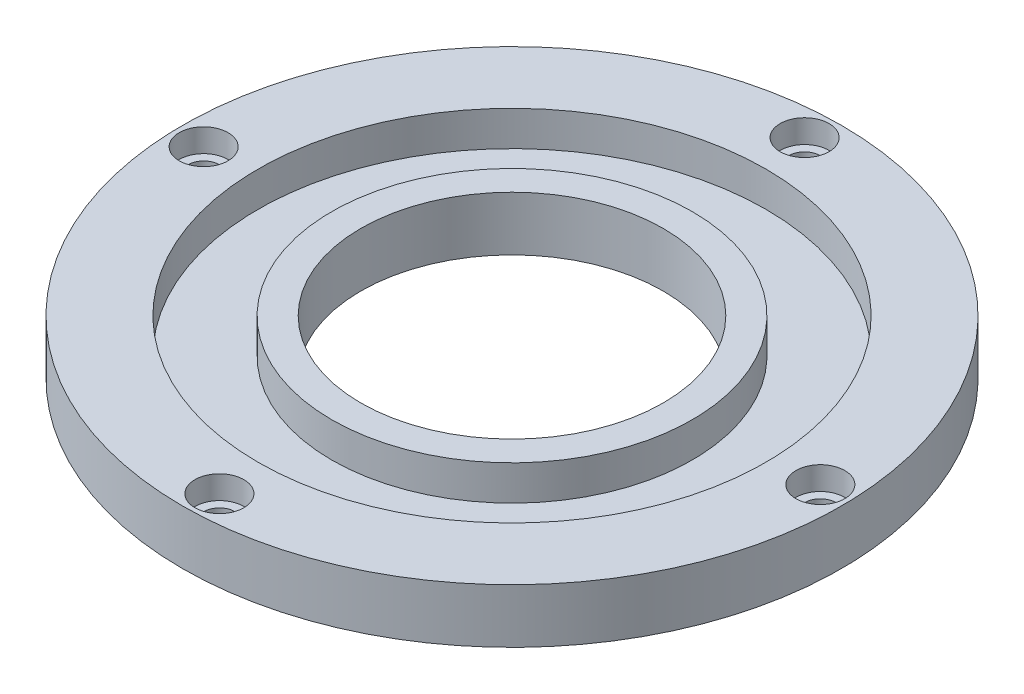
ISO-10303-21;
HEADER;
FILE_DESCRIPTION(('STEP AP214'),'2;1');
FILE_NAME('part.step','',(''),(''),'','','');
FILE_SCHEMA(('AUTOMOTIVE_DESIGN { 1 0 10303 214 1 1 1 1 }'));
ENDSEC;
DATA;
#1=APPLICATION_CONTEXT('core data for automotive mechanical design processes');
#2=APPLICATION_PROTOCOL_DEFINITION('international standard','automotive_design',2000,#1);
#3=PRODUCT_CONTEXT('',#1,'mechanical');
#4=PRODUCT('Part','Part','',(#3));
#5=PRODUCT_RELATED_PRODUCT_CATEGORY('part','',(#4));
#6=PRODUCT_DEFINITION_FORMATION('','',#4);
#7=PRODUCT_DEFINITION_CONTEXT('part definition',#1,'design');
#8=PRODUCT_DEFINITION('design','',#6,#7);
#9=PRODUCT_DEFINITION_SHAPE('','',#8);
#10=(LENGTH_UNIT() NAMED_UNIT(*) SI_UNIT(.MILLI.,.METRE.));
#11=(NAMED_UNIT(*) PLANE_ANGLE_UNIT() SI_UNIT($,.RADIAN.));
#12=(NAMED_UNIT(*) SI_UNIT($,.STERADIAN.) SOLID_ANGLE_UNIT());
#13=UNCERTAINTY_MEASURE_WITH_UNIT(LENGTH_MEASURE(1.E-05),#10,'distance_accuracy_value','');
#14=(GEOMETRIC_REPRESENTATION_CONTEXT(3) GLOBAL_UNCERTAINTY_ASSIGNED_CONTEXT((#13)) GLOBAL_UNIT_ASSIGNED_CONTEXT((#10,
#11,#12)) REPRESENTATION_CONTEXT('',''));
#15=CARTESIAN_POINT('',(0.,0.,0.));
#16=DIRECTION('',(0.,0.,1.));
#17=DIRECTION('',(1.,0.,0.));
#18=AXIS2_PLACEMENT_3D('',#15,#16,#17);
#19=CARTESIAN_POINT('',(1.01540604603969,0.,38.75));
#20=DIRECTION('',(0.,1.,0.));
#21=DIRECTION('',(0.,0.,1.));
#22=AXIS2_PLACEMENT_3D('',#19,#20,#21);
#23=CYLINDRICAL_SURFACE('',#22,2.);
#24=CARTESIAN_POINT('',(1.01540604603969,0.,38.75));
#25=DIRECTION('',(0.,1.,0.));
#26=DIRECTION('',(0.,0.,1.));
#27=AXIS2_PLACEMENT_3D('',#24,#25,#26);
#28=CIRCLE('',#27,2.);
#29=CARTESIAN_POINT('',(1.01540604603969,0.,40.75));
#30=VERTEX_POINT('',#29);
#31=EDGE_CURVE('E69',#30,#30,#28,.T.);
#32=ORIENTED_EDGE('',*,*,#31,.F.);
#33=EDGE_LOOP('',(#32));
#34=FACE_BOUND('',#33,.T.);
#35=CARTESIAN_POINT('',(1.01540604603969,4.,38.75));
#36=DIRECTION('',(0.,1.,0.));
#37=DIRECTION('',(0.,0.,1.));
#38=AXIS2_PLACEMENT_3D('',#35,#36,#37);
#39=CIRCLE('',#38,2.);
#40=CARTESIAN_POINT('',(1.01540604603969,4.,40.75));
#41=VERTEX_POINT('',#40);
#42=EDGE_CURVE('E41',#41,#41,#39,.F.);
#43=ORIENTED_EDGE('',*,*,#42,.F.);
#44=EDGE_LOOP('',(#43));
#45=FACE_BOUND('',#44,.T.);
#46=ADVANCED_FACE('F37',(#34,#45),#23,.F.);
#47=CARTESIAN_POINT('',(38.75,0.,-1.01540604603983));
#48=DIRECTION('',(0.,1.,0.));
#49=DIRECTION('',(0.,0.,1.));
#50=AXIS2_PLACEMENT_3D('',#47,#48,#49);
#51=CYLINDRICAL_SURFACE('',#50,2.00000000000001);
#52=CARTESIAN_POINT('',(38.75,0.,-1.01540604603983));
#53=DIRECTION('',(0.,1.,0.));
#54=DIRECTION('',(0.,0.,1.));
#55=AXIS2_PLACEMENT_3D('',#52,#53,#54);
#56=CIRCLE('',#55,2.00000000000001);
#57=CARTESIAN_POINT('',(38.75,0.,0.984593953960173));
#58=VERTEX_POINT('',#57);
#59=EDGE_CURVE('E74',#58,#58,#56,.T.);
#60=ORIENTED_EDGE('',*,*,#59,.F.);
#61=EDGE_LOOP('',(#60));
#62=FACE_BOUND('',#61,.T.);
#63=CARTESIAN_POINT('',(38.75,4.,-1.01540604603983));
#64=DIRECTION('',(0.,1.,0.));
#65=DIRECTION('',(0.,0.,1.));
#66=AXIS2_PLACEMENT_3D('',#63,#64,#65);
#67=CIRCLE('',#66,2.00000000000001);
#68=CARTESIAN_POINT('',(38.75,4.,0.984593953960173));
#69=VERTEX_POINT('',#68);
#70=EDGE_CURVE('E61',#69,#69,#67,.F.);
#71=ORIENTED_EDGE('',*,*,#70,.F.);
#72=EDGE_LOOP('',(#71));
#73=FACE_BOUND('',#72,.T.);
#74=ADVANCED_FACE('F124',(#62,#73),#51,.F.);
#75=CARTESIAN_POINT('',(-1.01540604603997,0.,-38.75));
#76=DIRECTION('',(0.,1.,0.));
#77=DIRECTION('',(0.,0.,1.));
#78=AXIS2_PLACEMENT_3D('',#75,#76,#77);
#79=CYLINDRICAL_SURFACE('',#78,2.00000000000001);
#80=CARTESIAN_POINT('',(-1.01540604603997,0.,-38.75));
#81=DIRECTION('',(0.,1.,0.));
#82=DIRECTION('',(0.,0.,1.));
#83=AXIS2_PLACEMENT_3D('',#80,#81,#82);
#84=CIRCLE('',#83,2.00000000000001);
#85=CARTESIAN_POINT('',(-1.01540604603997,0.,-36.75));
#86=VERTEX_POINT('',#85);
#87=EDGE_CURVE('E80',#86,#86,#84,.T.);
#88=ORIENTED_EDGE('',*,*,#87,.F.);
#89=EDGE_LOOP('',(#88));
#90=FACE_BOUND('',#89,.T.);
#91=CARTESIAN_POINT('',(-1.01540604603997,4.,-38.75));
#92=DIRECTION('',(0.,1.,0.));
#93=DIRECTION('',(0.,0.,1.));
#94=AXIS2_PLACEMENT_3D('',#91,#92,#93);
#95=CIRCLE('',#94,2.00000000000001);
#96=CARTESIAN_POINT('',(-1.01540604603997,4.,-36.75));
#97=VERTEX_POINT('',#96);
#98=EDGE_CURVE('E198',#97,#97,#95,.T.);
#99=ORIENTED_EDGE('',*,*,#98,.T.);
#100=EDGE_LOOP('',(#99));
#101=FACE_BOUND('',#100,.T.);
#102=ADVANCED_FACE('F130',(#90,#101),#79,.F.);
#103=CARTESIAN_POINT('',(-38.75,0.,1.0154060460401));
#104=DIRECTION('',(0.,1.,0.));
#105=DIRECTION('',(0.,0.,1.));
#106=AXIS2_PLACEMENT_3D('',#103,#104,#105);
#107=CYLINDRICAL_SURFACE('',#106,2.);
#108=CARTESIAN_POINT('',(-38.75,0.,1.0154060460401));
#109=DIRECTION('',(0.,1.,0.));
#110=DIRECTION('',(0.,0.,1.));
#111=AXIS2_PLACEMENT_3D('',#108,#109,#110);
#112=CIRCLE('',#111,2.);
#113=CARTESIAN_POINT('',(-38.75,0.,3.01540604604011));
#114=VERTEX_POINT('',#113);
#115=EDGE_CURVE('E93',#114,#114,#112,.T.);
#116=ORIENTED_EDGE('',*,*,#115,.F.);
#117=EDGE_LOOP('',(#116));
#118=FACE_BOUND('',#117,.T.);
#119=CARTESIAN_POINT('',(-38.75,4.,1.0154060460401));
#120=DIRECTION('',(0.,1.,0.));
#121=DIRECTION('',(0.,0.,1.));
#122=AXIS2_PLACEMENT_3D('',#119,#120,#121);
#123=CIRCLE('',#122,2.);
#124=CARTESIAN_POINT('',(-38.75,4.,3.01540604604011));
#125=VERTEX_POINT('',#124);
#126=EDGE_CURVE('E58',#125,#125,#123,.F.);
#127=ORIENTED_EDGE('',*,*,#126,.F.);
#128=EDGE_LOOP('',(#127));
#129=FACE_BOUND('',#128,.T.);
#130=ADVANCED_FACE('F160',(#118,#129),#107,.F.);
#131=CARTESIAN_POINT('',(0.,7.,0.));
#132=DIRECTION('',(0.,1.,0.));
#133=DIRECTION('',(0.,0.,1.));
#134=AXIS2_PLACEMENT_3D('',#131,#132,#133);
#135=PLANE('',#134);
#136=CARTESIAN_POINT('',(0.,7.,0.));
#137=DIRECTION('',(0.,1.,0.));
#138=DIRECTION('',(0.,0.,1.));
#139=AXIS2_PLACEMENT_3D('',#136,#137,#138);
#140=CIRCLE('',#139,19.5);
#141=CARTESIAN_POINT('',(0.,7.,19.5));
#142=VERTEX_POINT('',#141);
#143=EDGE_CURVE('E52',#142,#142,#140,.T.);
#144=ORIENTED_EDGE('',*,*,#143,.F.);
#145=EDGE_LOOP('',(#144));
#146=FACE_BOUND('',#145,.T.);
#147=CARTESIAN_POINT('',(0.,7.,0.));
#148=DIRECTION('',(0.,1.,0.));
#149=DIRECTION('',(0.,0.,1.));
#150=AXIS2_PLACEMENT_3D('',#147,#148,#149);
#151=CIRCLE('',#150,23.25);
#152=CARTESIAN_POINT('',(0.,7.,23.25));
#153=VERTEX_POINT('',#152);
#154=EDGE_CURVE('E89',#153,#153,#151,.T.);
#155=ORIENTED_EDGE('',*,*,#154,.T.);
#156=EDGE_LOOP('',(#155));
#157=FACE_BOUND('',#156,.T.);
#158=ADVANCED_FACE('F153',(#146,#157),#135,.T.);
#159=CARTESIAN_POINT('',(-1.01540604603997,7.,-38.75));
#160=DIRECTION('',(0.,1.,0.));
#161=DIRECTION('',(0.,0.,1.));
#162=AXIS2_PLACEMENT_3D('',#159,#160,#161);
#163=CIRCLE('',#162,3.15);
#164=CARTESIAN_POINT('',(-1.01540604603997,7.,-35.6));
#165=VERTEX_POINT('',#164);
#166=EDGE_CURVE('E165',#165,#165,#163,.T.);
#167=ORIENTED_EDGE('',*,*,#166,.F.);
#168=EDGE_LOOP('',(#167));
#169=FACE_BOUND('',#168,.T.);
#170=CARTESIAN_POINT('',(38.7500000000011,7.,-1.01540604604107));
#171=DIRECTION('',(0.,1.,0.));
#172=DIRECTION('',(0.,0.,1.));
#173=AXIS2_PLACEMENT_3D('',#170,#171,#172);
#174=CIRCLE('',#173,3.15000000000087);
#175=CARTESIAN_POINT('',(38.7500000000011,7.,2.1345939539598));
#176=VERTEX_POINT('',#175);
#177=EDGE_CURVE('E169',#176,#176,#174,.T.);
#178=ORIENTED_EDGE('',*,*,#177,.F.);
#179=EDGE_LOOP('',(#178));
#180=FACE_BOUND('',#179,.T.);
#181=CARTESIAN_POINT('',(1.01540604604215,7.,38.75));
#182=DIRECTION('',(0.,1.,0.));
#183=DIRECTION('',(0.,0.,1.));
#184=AXIS2_PLACEMENT_3D('',#181,#182,#183);
#185=CIRCLE('',#184,3.15000000000236);
#186=CARTESIAN_POINT('',(1.01540604604215,7.,41.9000000000023));
#187=VERTEX_POINT('',#186);
#188=EDGE_CURVE('E173',#187,#187,#185,.T.);
#189=ORIENTED_EDGE('',*,*,#188,.F.);
#190=EDGE_LOOP('',(#189));
#191=FACE_BOUND('',#190,.T.);
#192=CARTESIAN_POINT('',(-38.7499999999989,7.,1.01540604604105));
#193=DIRECTION('',(0.,1.,0.));
#194=DIRECTION('',(0.,0.,1.));
#195=AXIS2_PLACEMENT_3D('',#192,#193,#194);
#196=CIRCLE('',#195,3.15000000000175);
#197=CARTESIAN_POINT('',(-38.7499999999989,7.,4.16540604604279));
#198=VERTEX_POINT('',#197);
#199=EDGE_CURVE('E176',#198,#198,#196,.T.);
#200=ORIENTED_EDGE('',*,*,#199,.F.);
#201=EDGE_LOOP('',(#200));
#202=FACE_BOUND('',#201,.T.);
#203=CARTESIAN_POINT('',(0.,7.,0.));
#204=DIRECTION('',(0.,1.,0.));
#205=DIRECTION('',(0.,0.,1.));
#206=AXIS2_PLACEMENT_3D('',#203,#204,#205);
#207=CIRCLE('',#206,32.75);
#208=CARTESIAN_POINT('',(0.,7.,32.75));
#209=VERTEX_POINT('',#208);
#210=EDGE_CURVE('E88',#209,#209,#207,.T.);
#211=ORIENTED_EDGE('',*,*,#210,.F.);
#212=EDGE_LOOP('',(#211));
#213=FACE_BOUND('',#212,.T.);
#214=CARTESIAN_POINT('',(0.,7.,0.));
#215=DIRECTION('',(0.,1.,0.));
#216=DIRECTION('',(0.,0.,1.));
#217=AXIS2_PLACEMENT_3D('',#214,#215,#216);
#218=CIRCLE('',#217,42.5);
#219=CARTESIAN_POINT('',(0.,7.,42.5));
#220=VERTEX_POINT('',#219);
#221=EDGE_CURVE('E10',#220,#220,#218,.T.);
#222=ORIENTED_EDGE('',*,*,#221,.T.);
#223=EDGE_LOOP('',(#222));
#224=FACE_BOUND('',#223,.T.);
#225=ADVANCED_FACE('F151',(#169,#180,#191,#202,#213,#224),#135,.T.);
#226=CARTESIAN_POINT('',(0.,0.,0.));
#227=DIRECTION('',(0.,1.,0.));
#228=DIRECTION('',(0.,0.,1.));
#229=AXIS2_PLACEMENT_3D('',#226,#227,#228);
#230=PLANE('',#229);
#231=ORIENTED_EDGE('',*,*,#115,.T.);
#232=EDGE_LOOP('',(#231));
#233=FACE_BOUND('',#232,.T.);
#234=ORIENTED_EDGE('',*,*,#87,.T.);
#235=EDGE_LOOP('',(#234));
#236=FACE_BOUND('',#235,.T.);
#237=ORIENTED_EDGE('',*,*,#59,.T.);
#238=EDGE_LOOP('',(#237));
#239=FACE_BOUND('',#238,.T.);
#240=ORIENTED_EDGE('',*,*,#31,.T.);
#241=EDGE_LOOP('',(#240));
#242=FACE_BOUND('',#241,.T.);
#243=CARTESIAN_POINT('',(0.,0.,0.));
#244=DIRECTION('',(0.,1.,0.));
#245=DIRECTION('',(0.,0.,1.));
#246=AXIS2_PLACEMENT_3D('',#243,#244,#245);
#247=CIRCLE('',#246,42.5);
#248=CARTESIAN_POINT('',(0.,0.,42.5));
#249=VERTEX_POINT('',#248);
#250=EDGE_CURVE('E46',#249,#249,#247,.T.);
#251=ORIENTED_EDGE('',*,*,#250,.F.);
#252=EDGE_LOOP('',(#251));
#253=FACE_BOUND('',#252,.T.);
#254=CARTESIAN_POINT('',(0.,0.,0.));
#255=DIRECTION('',(0.,1.,0.));
#256=DIRECTION('',(0.,0.,1.));
#257=AXIS2_PLACEMENT_3D('',#254,#255,#256);
#258=CIRCLE('',#257,19.5);
#259=CARTESIAN_POINT('',(0.,0.,19.5));
#260=VERTEX_POINT('',#259);
#261=EDGE_CURVE('E55',#260,#260,#258,.T.);
#262=ORIENTED_EDGE('',*,*,#261,.T.);
#263=EDGE_LOOP('',(#262));
#264=FACE_BOUND('',#263,.T.);
#265=ADVANCED_FACE('F108',(#233,#236,#239,#242,#253,#264),#230,.F.);
#266=CARTESIAN_POINT('',(0.,7.,0.));
#267=DIRECTION('',(0.,-1.,0.));
#268=DIRECTION('',(0.,0.,-1.));
#269=AXIS2_PLACEMENT_3D('',#266,#267,#268);
#270=CYLINDRICAL_SURFACE('',#269,42.5);
#271=ORIENTED_EDGE('',*,*,#221,.F.);
#272=EDGE_LOOP('',(#271));
#273=FACE_BOUND('',#272,.T.);
#274=ORIENTED_EDGE('',*,*,#250,.T.);
#275=EDGE_LOOP('',(#274));
#276=FACE_BOUND('',#275,.T.);
#277=ADVANCED_FACE('F39',(#273,#276),#270,.T.);
#278=CARTESIAN_POINT('',(0.,7.,0.));
#279=DIRECTION('',(0.,-1.,0.));
#280=DIRECTION('',(0.,0.,-1.));
#281=AXIS2_PLACEMENT_3D('',#278,#279,#280);
#282=CYLINDRICAL_SURFACE('',#281,19.5);
#283=ORIENTED_EDGE('',*,*,#143,.T.);
#284=EDGE_LOOP('',(#283));
#285=FACE_BOUND('',#284,.T.);
#286=ORIENTED_EDGE('',*,*,#261,.F.);
#287=EDGE_LOOP('',(#286));
#288=FACE_BOUND('',#287,.T.);
#289=ADVANCED_FACE('F110',(#285,#288),#282,.F.);
#290=CARTESIAN_POINT('',(0.,2.5,0.));
#291=DIRECTION('',(0.,1.,0.));
#292=DIRECTION('',(0.,0.,1.));
#293=AXIS2_PLACEMENT_3D('',#290,#291,#292);
#294=CYLINDRICAL_SURFACE('',#293,32.75);
#295=CARTESIAN_POINT('',(0.,2.5,0.));
#296=DIRECTION('',(0.,1.,0.));
#297=DIRECTION('',(0.,0.,1.));
#298=AXIS2_PLACEMENT_3D('',#295,#296,#297);
#299=CIRCLE('',#298,32.75);
#300=CARTESIAN_POINT('',(0.,2.5,32.75));
#301=VERTEX_POINT('',#300);
#302=EDGE_CURVE('E94',#301,#301,#299,.T.);
#303=ORIENTED_EDGE('',*,*,#302,.F.);
#304=EDGE_LOOP('',(#303));
#305=FACE_BOUND('',#304,.T.);
#306=ORIENTED_EDGE('',*,*,#210,.T.);
#307=EDGE_LOOP('',(#306));
#308=FACE_BOUND('',#307,.T.);
#309=ADVANCED_FACE('F112',(#305,#308),#294,.F.);
#310=CARTESIAN_POINT('',(0.,2.5,0.));
#311=DIRECTION('',(0.,1.,0.));
#312=DIRECTION('',(0.,0.,1.));
#313=AXIS2_PLACEMENT_3D('',#310,#311,#312);
#314=PLANE('',#313);
#315=CARTESIAN_POINT('',(0.,2.5,0.));
#316=DIRECTION('',(0.,1.,0.));
#317=DIRECTION('',(0.,0.,1.));
#318=AXIS2_PLACEMENT_3D('',#315,#316,#317);
#319=CIRCLE('',#318,23.25);
#320=CARTESIAN_POINT('',(0.,2.5,23.25));
#321=VERTEX_POINT('',#320);
#322=EDGE_CURVE('E84',#321,#321,#319,.T.);
#323=ORIENTED_EDGE('',*,*,#322,.F.);
#324=EDGE_LOOP('',(#323));
#325=FACE_BOUND('',#324,.T.);
#326=ORIENTED_EDGE('',*,*,#302,.T.);
#327=EDGE_LOOP('',(#326));
#328=FACE_BOUND('',#327,.T.);
#329=ADVANCED_FACE('F118',(#325,#328),#314,.T.);
#330=CARTESIAN_POINT('',(0.,2.5,0.));
#331=DIRECTION('',(0.,1.,0.));
#332=DIRECTION('',(0.,0.,1.));
#333=AXIS2_PLACEMENT_3D('',#330,#331,#332);
#334=CYLINDRICAL_SURFACE('',#333,23.25);
#335=ORIENTED_EDGE('',*,*,#322,.T.);
#336=EDGE_LOOP('',(#335));
#337=FACE_BOUND('',#336,.T.);
#338=ORIENTED_EDGE('',*,*,#154,.F.);
#339=EDGE_LOOP('',(#338));
#340=FACE_BOUND('',#339,.T.);
#341=ADVANCED_FACE('F136',(#337,#340),#334,.T.);
#342=CARTESIAN_POINT('',(-38.7499999999989,4.,1.01540604604105));
#343=DIRECTION('',(0.,1.,0.));
#344=DIRECTION('',(0.,0.,1.));
#345=AXIS2_PLACEMENT_3D('',#342,#343,#344);
#346=PLANE('',#345);
#347=CARTESIAN_POINT('',(-38.7499999999989,4.,1.01540604604105));
#348=DIRECTION('',(0.,1.,0.));
#349=DIRECTION('',(0.,0.,1.));
#350=AXIS2_PLACEMENT_3D('',#347,#348,#349);
#351=CIRCLE('',#350,3.15000000000175);
#352=CARTESIAN_POINT('',(-38.7499999999989,4.,4.16540604604279));
#353=VERTEX_POINT('',#352);
#354=EDGE_CURVE('E179',#353,#353,#351,.T.);
#355=ORIENTED_EDGE('',*,*,#354,.T.);
#356=EDGE_LOOP('',(#355));
#357=FACE_BOUND('',#356,.T.);
#358=ORIENTED_EDGE('',*,*,#126,.T.);
#359=EDGE_LOOP('',(#358));
#360=FACE_BOUND('',#359,.T.);
#361=ADVANCED_FACE('F139',(#357,#360),#346,.T.);
#362=CARTESIAN_POINT('',(-38.7499999999989,4.,1.01540604604105));
#363=DIRECTION('',(0.,1.,0.));
#364=DIRECTION('',(0.,0.,1.));
#365=AXIS2_PLACEMENT_3D('',#362,#363,#364);
#366=CYLINDRICAL_SURFACE('',#365,3.15000000000175);
#367=ORIENTED_EDGE('',*,*,#354,.F.);
#368=EDGE_LOOP('',(#367));
#369=FACE_BOUND('',#368,.T.);
#370=ORIENTED_EDGE('',*,*,#199,.T.);
#371=EDGE_LOOP('',(#370));
#372=FACE_BOUND('',#371,.T.);
#373=ADVANCED_FACE('F235',(#369,#372),#366,.F.);
#374=CARTESIAN_POINT('',(-1.01540604603997,4.,-38.75));
#375=DIRECTION('',(0.,1.,0.));
#376=DIRECTION('',(0.,0.,1.));
#377=AXIS2_PLACEMENT_3D('',#374,#375,#376);
#378=CYLINDRICAL_SURFACE('',#377,3.15);
#379=CARTESIAN_POINT('',(-1.01540604603997,4.,-38.75));
#380=DIRECTION('',(0.,1.,0.));
#381=DIRECTION('',(0.,0.,1.));
#382=AXIS2_PLACEMENT_3D('',#379,#380,#381);
#383=CIRCLE('',#382,3.15);
#384=CARTESIAN_POINT('',(-1.01540604603997,4.,-35.6));
#385=VERTEX_POINT('',#384);
#386=EDGE_CURVE('E62',#385,#385,#383,.T.);
#387=ORIENTED_EDGE('',*,*,#386,.F.);
#388=EDGE_LOOP('',(#387));
#389=FACE_BOUND('',#388,.T.);
#390=ORIENTED_EDGE('',*,*,#166,.T.);
#391=EDGE_LOOP('',(#390));
#392=FACE_BOUND('',#391,.T.);
#393=ADVANCED_FACE('F239',(#389,#392),#378,.F.);
#394=CARTESIAN_POINT('',(-1.01540604603997,4.,-38.75));
#395=DIRECTION('',(0.,1.,0.));
#396=DIRECTION('',(0.,0.,1.));
#397=AXIS2_PLACEMENT_3D('',#394,#395,#396);
#398=PLANE('',#397);
#399=ORIENTED_EDGE('',*,*,#98,.F.);
#400=EDGE_LOOP('',(#399));
#401=FACE_BOUND('',#400,.T.);
#402=ORIENTED_EDGE('',*,*,#386,.T.);
#403=EDGE_LOOP('',(#402));
#404=FACE_BOUND('',#403,.T.);
#405=ADVANCED_FACE('F318',(#401,#404),#398,.T.);
#406=CARTESIAN_POINT('',(38.7500000000011,4.,-1.01540604604107));
#407=DIRECTION('',(0.,1.,0.));
#408=DIRECTION('',(0.,0.,1.));
#409=AXIS2_PLACEMENT_3D('',#406,#407,#408);
#410=PLANE('',#409);
#411=CARTESIAN_POINT('',(38.7500000000011,4.,-1.01540604604107));
#412=DIRECTION('',(0.,1.,0.));
#413=DIRECTION('',(0.,0.,1.));
#414=AXIS2_PLACEMENT_3D('',#411,#412,#413);
#415=CIRCLE('',#414,3.15000000000087);
#416=CARTESIAN_POINT('',(38.7500000000011,4.,2.1345939539598));
#417=VERTEX_POINT('',#416);
#418=EDGE_CURVE('E201',#417,#417,#415,.T.);
#419=ORIENTED_EDGE('',*,*,#418,.T.);
#420=EDGE_LOOP('',(#419));
#421=FACE_BOUND('',#420,.T.);
#422=ORIENTED_EDGE('',*,*,#70,.T.);
#423=EDGE_LOOP('',(#422));
#424=FACE_BOUND('',#423,.T.);
#425=ADVANCED_FACE('F327',(#421,#424),#410,.T.);
#426=CARTESIAN_POINT('',(38.7500000000011,4.,-1.01540604604107));
#427=DIRECTION('',(0.,1.,0.));
#428=DIRECTION('',(0.,0.,1.));
#429=AXIS2_PLACEMENT_3D('',#426,#427,#428);
#430=CYLINDRICAL_SURFACE('',#429,3.15000000000087);
#431=ORIENTED_EDGE('',*,*,#418,.F.);
#432=EDGE_LOOP('',(#431));
#433=FACE_BOUND('',#432,.T.);
#434=ORIENTED_EDGE('',*,*,#177,.T.);
#435=EDGE_LOOP('',(#434));
#436=FACE_BOUND('',#435,.T.);
#437=ADVANCED_FACE('F227',(#433,#436),#430,.F.);
#438=CARTESIAN_POINT('',(1.01540604604215,4.,38.75));
#439=DIRECTION('',(0.,1.,0.));
#440=DIRECTION('',(0.,0.,1.));
#441=AXIS2_PLACEMENT_3D('',#438,#439,#440);
#442=PLANE('',#441);
#443=CARTESIAN_POINT('',(1.01540604604215,4.,38.75));
#444=DIRECTION('',(0.,1.,0.));
#445=DIRECTION('',(0.,0.,1.));
#446=AXIS2_PLACEMENT_3D('',#443,#444,#445);
#447=CIRCLE('',#446,3.15000000000236);
#448=CARTESIAN_POINT('',(1.01540604604215,4.,41.9000000000023));
#449=VERTEX_POINT('',#448);
#450=EDGE_CURVE('E214',#449,#449,#447,.T.);
#451=ORIENTED_EDGE('',*,*,#450,.T.);
#452=EDGE_LOOP('',(#451));
#453=FACE_BOUND('',#452,.T.);
#454=ORIENTED_EDGE('',*,*,#42,.T.);
#455=EDGE_LOOP('',(#454));
#456=FACE_BOUND('',#455,.T.);
#457=ADVANCED_FACE('F221',(#453,#456),#442,.T.);
#458=CARTESIAN_POINT('',(1.01540604604215,4.,38.75));
#459=DIRECTION('',(0.,1.,0.));
#460=DIRECTION('',(0.,0.,1.));
#461=AXIS2_PLACEMENT_3D('',#458,#459,#460);
#462=CYLINDRICAL_SURFACE('',#461,3.15000000000236);
#463=ORIENTED_EDGE('',*,*,#450,.F.);
#464=EDGE_LOOP('',(#463));
#465=FACE_BOUND('',#464,.T.);
#466=ORIENTED_EDGE('',*,*,#188,.T.);
#467=EDGE_LOOP('',(#466));
#468=FACE_BOUND('',#467,.T.);
#469=ADVANCED_FACE('F219',(#465,#468),#462,.F.);
#470=CLOSED_SHELL('',(#46,#74,#102,#130,#158,#225,#265,#277,#289,#309,#329,#341,#361,#373,#393,
#405,#425,#437,#457,#469));
#471=MANIFOLD_SOLID_BREP('B2',#470);
#472=ADVANCED_BREP_SHAPE_REPRESENTATION('',(#18,#471),#14);
#473=SHAPE_DEFINITION_REPRESENTATION(#9,#472);
ENDSEC;
END-ISO-10303-21;
